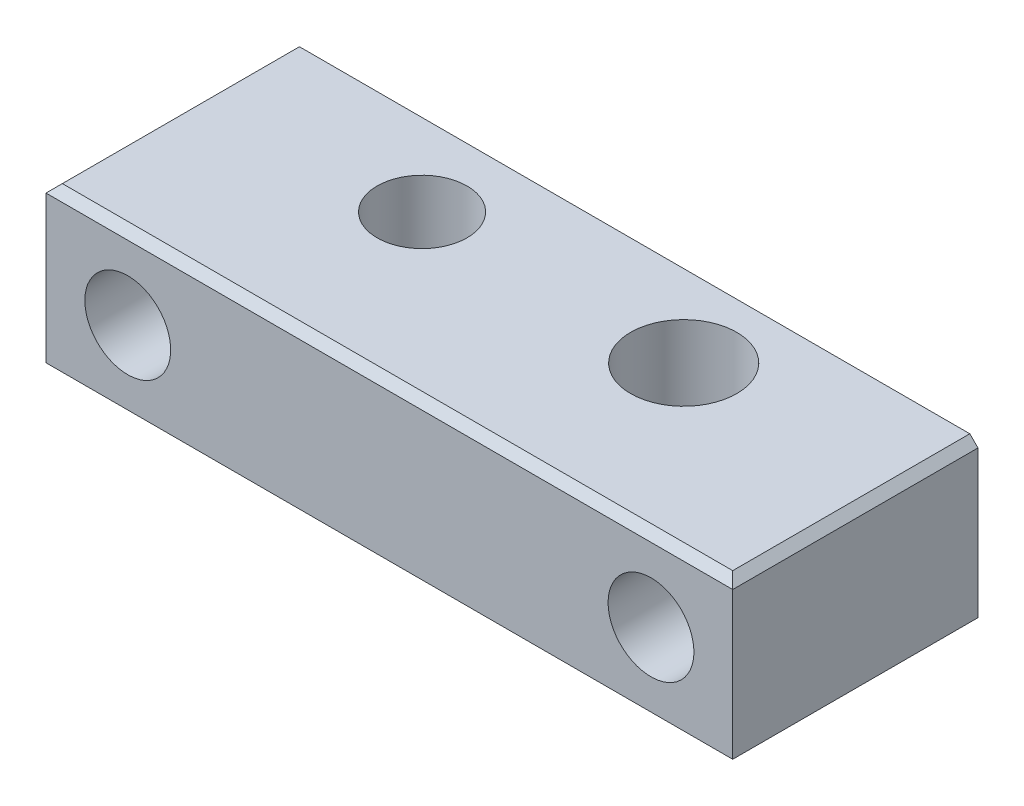
ISO-10303-21;
HEADER;
FILE_DESCRIPTION(('STEP AP214'),'2;1');
FILE_NAME('part.step','',(''),(''),'','','');
FILE_SCHEMA(('AUTOMOTIVE_DESIGN { 1 0 10303 214 1 1 1 1 }'));
ENDSEC;
DATA;
#1=APPLICATION_CONTEXT('core data for automotive mechanical design processes');
#2=APPLICATION_PROTOCOL_DEFINITION('international standard','automotive_design',2000,#1);
#3=PRODUCT_CONTEXT('',#1,'mechanical');
#4=PRODUCT('Part','Part','',(#3));
#5=PRODUCT_RELATED_PRODUCT_CATEGORY('part','',(#4));
#6=PRODUCT_DEFINITION_FORMATION('','',#4);
#7=PRODUCT_DEFINITION_CONTEXT('part definition',#1,'design');
#8=PRODUCT_DEFINITION('design','',#6,#7);
#9=PRODUCT_DEFINITION_SHAPE('','',#8);
#10=(LENGTH_UNIT() NAMED_UNIT(*) SI_UNIT(.MILLI.,.METRE.));
#11=(NAMED_UNIT(*) PLANE_ANGLE_UNIT() SI_UNIT($,.RADIAN.));
#12=(NAMED_UNIT(*) SI_UNIT($,.STERADIAN.) SOLID_ANGLE_UNIT());
#13=UNCERTAINTY_MEASURE_WITH_UNIT(LENGTH_MEASURE(1.E-05),#10,'distance_accuracy_value','');
#14=(GEOMETRIC_REPRESENTATION_CONTEXT(3) GLOBAL_UNCERTAINTY_ASSIGNED_CONTEXT((#13)) GLOBAL_UNIT_ASSIGNED_CONTEXT((#10,
#11,#12)) REPRESENTATION_CONTEXT('',''));
#15=CARTESIAN_POINT('',(0.,0.,0.));
#16=DIRECTION('',(0.,0.,1.));
#17=DIRECTION('',(1.,0.,0.));
#18=AXIS2_PLACEMENT_3D('',#15,#16,#17);
#19=CARTESIAN_POINT('',(66.675,15.8623,23.8125));
#20=DIRECTION('',(-1.,0.,0.));
#21=DIRECTION('',(0.,0.,1.));
#22=AXIS2_PLACEMENT_3D('',#19,#20,#21);
#23=PLANE('',#22);
#24=DIRECTION('',(0.,-1.,0.));
#25=VECTOR('',#24,1.);
#26=CARTESIAN_POINT('',(66.675,15.8623,-23.8125));
#27=LINE('',#26,#25);
#28=CARTESIAN_POINT('',(66.675,14.2748,-23.8125));
#29=VERTEX_POINT('',#28);
#30=CARTESIAN_POINT('',(66.675,-14.2748,-23.8125));
#31=VERTEX_POINT('',#30);
#32=EDGE_CURVE('E153',#29,#31,#27,.T.);
#33=ORIENTED_EDGE('',*,*,#32,.F.);
#34=DIRECTION('',(0.,0.,1.));
#35=VECTOR('',#34,1.);
#36=CARTESIAN_POINT('',(66.675,14.2748,23.8125));
#37=LINE('',#36,#35);
#38=CARTESIAN_POINT('',(66.675,14.2748,23.8125));
#39=VERTEX_POINT('',#38);
#40=EDGE_CURVE('E114',#29,#39,#37,.T.);
#41=ORIENTED_EDGE('',*,*,#40,.T.);
#42=DIRECTION('',(0.,-1.,0.));
#43=VECTOR('',#42,1.);
#44=CARTESIAN_POINT('',(66.675,15.8623,23.8125));
#45=LINE('',#44,#43);
#46=CARTESIAN_POINT('',(66.675,-14.2748,23.8125));
#47=VERTEX_POINT('',#46);
#48=EDGE_CURVE('E135',#39,#47,#45,.T.);
#49=ORIENTED_EDGE('',*,*,#48,.T.);
#50=DIRECTION('',(0.,0.,-1.));
#51=VECTOR('',#50,1.);
#52=CARTESIAN_POINT('',(66.675,-14.2748,-23.8125));
#53=LINE('',#52,#51);
#54=EDGE_CURVE('E119',#47,#31,#53,.T.);
#55=ORIENTED_EDGE('',*,*,#54,.T.);
#56=EDGE_LOOP('',(#33,#41,#49,#55));
#57=FACE_BOUND('',#56,.T.);
#58=ADVANCED_FACE('F45',(#57),#23,.F.);
#59=CARTESIAN_POINT('',(-66.675,15.8623,-23.8125));
#60=DIRECTION('',(0.,0.,1.));
#61=DIRECTION('',(1.,0.,0.));
#62=AXIS2_PLACEMENT_3D('',#59,#60,#61);
#63=PLANE('',#62);
#64=CARTESIAN_POINT('',(-50.8,-0.0126999999999986,-23.8125));
#65=DIRECTION('',(0.,0.,1.));
#66=DIRECTION('',(1.,0.,0.));
#67=AXIS2_PLACEMENT_3D('',#64,#65,#66);
#68=CIRCLE('',#67,12.7);
#69=CARTESIAN_POINT('',(-38.1,-0.0126999999999986,-23.8125));
#70=VERTEX_POINT('',#69);
#71=EDGE_CURVE('E440',#70,#70,#68,.T.);
#72=ORIENTED_EDGE('',*,*,#71,.T.);
#73=EDGE_LOOP('',(#72));
#74=FACE_BOUND('',#73,.T.);
#75=CARTESIAN_POINT('',(50.8,-0.0127000000000014,-23.8125));
#76=DIRECTION('',(0.,0.,1.));
#77=DIRECTION('',(1.,0.,0.));
#78=AXIS2_PLACEMENT_3D('',#75,#76,#77);
#79=CIRCLE('',#78,12.7);
#80=CARTESIAN_POINT('',(63.5,-0.0127000000000014,-23.8125));
#81=VERTEX_POINT('',#80);
#82=EDGE_CURVE('E442',#81,#81,#79,.T.);
#83=ORIENTED_EDGE('',*,*,#82,.T.);
#84=EDGE_LOOP('',(#83));
#85=FACE_BOUND('',#84,.T.);
#86=DIRECTION('',(-1.,0.,0.));
#87=VECTOR('',#86,1.);
#88=CARTESIAN_POINT('',(-66.675,15.8623,-23.8125));
#89=LINE('',#88,#87);
#90=CARTESIAN_POINT('',(65.0875,15.8623,-23.8125));
#91=VERTEX_POINT('',#90);
#92=CARTESIAN_POINT('',(-65.0875,15.8623,-23.8125));
#93=VERTEX_POINT('',#92);
#94=EDGE_CURVE('E125',#91,#93,#89,.T.);
#95=ORIENTED_EDGE('',*,*,#94,.F.);
#96=DIRECTION('',(-0.707106781186548,0.707106781186548,0.));
#97=VECTOR('',#96,1.);
#98=CARTESIAN_POINT('',(65.0875,15.8623,-23.8125));
#99=LINE('',#98,#97);
#100=EDGE_CURVE('E109',#91,#29,#99,.F.);
#101=ORIENTED_EDGE('',*,*,#100,.T.);
#102=ORIENTED_EDGE('',*,*,#32,.T.);
#103=DIRECTION('',(-0.707106781186551,-0.707106781186544,0.));
#104=VECTOR('',#103,1.);
#105=CARTESIAN_POINT('',(66.675,-14.2748,-23.8125));
#106=LINE('',#105,#104);
#107=CARTESIAN_POINT('',(65.0875,-15.8623,-23.8125));
#108=VERTEX_POINT('',#107);
#109=EDGE_CURVE('E171',#31,#108,#106,.T.);
#110=ORIENTED_EDGE('',*,*,#109,.T.);
#111=DIRECTION('',(-1.,0.,0.));
#112=VECTOR('',#111,1.);
#113=CARTESIAN_POINT('',(-66.675,-15.8623,-23.8125));
#114=LINE('',#113,#112);
#115=CARTESIAN_POINT('',(-65.0875,-15.8623,-23.8125));
#116=VERTEX_POINT('',#115);
#117=EDGE_CURVE('E136',#108,#116,#114,.T.);
#118=ORIENTED_EDGE('',*,*,#117,.T.);
#119=DIRECTION('',(-0.707106781186551,0.707106781186544,0.));
#120=VECTOR('',#119,1.);
#121=CARTESIAN_POINT('',(-66.675,-14.2748,-23.8125));
#122=LINE('',#121,#120);
#123=CARTESIAN_POINT('',(-66.675,-14.2748,-23.8125));
#124=VERTEX_POINT('',#123);
#125=EDGE_CURVE('E130',#116,#124,#122,.T.);
#126=ORIENTED_EDGE('',*,*,#125,.T.);
#127=DIRECTION('',(0.,-1.,0.));
#128=VECTOR('',#127,1.);
#129=CARTESIAN_POINT('',(-66.675,15.8623,-23.8125));
#130=LINE('',#129,#128);
#131=CARTESIAN_POINT('',(-66.675,14.2748,-23.8125));
#132=VERTEX_POINT('',#131);
#133=EDGE_CURVE('E150',#132,#124,#130,.T.);
#134=ORIENTED_EDGE('',*,*,#133,.F.);
#135=DIRECTION('',(-0.707106781186548,-0.707106781186548,0.));
#136=VECTOR('',#135,1.);
#137=CARTESIAN_POINT('',(-65.0875,15.8623,-23.8125));
#138=LINE('',#137,#136);
#139=EDGE_CURVE('E120',#132,#93,#138,.F.);
#140=ORIENTED_EDGE('',*,*,#139,.T.);
#141=EDGE_LOOP('',(#95,#101,#102,#110,#118,#126,#134,#140));
#142=FACE_BOUND('',#141,.T.);
#143=ADVANCED_FACE('F132',(#74,#85,#142),#63,.F.);
#144=CARTESIAN_POINT('',(-66.675,15.8623,23.8125));
#145=DIRECTION('',(1.,0.,0.));
#146=DIRECTION('',(0.,0.,-1.));
#147=AXIS2_PLACEMENT_3D('',#144,#145,#146);
#148=PLANE('',#147);
#149=DIRECTION('',(0.,-1.,0.));
#150=VECTOR('',#149,1.);
#151=CARTESIAN_POINT('',(-66.675,15.8623,23.8125));
#152=LINE('',#151,#150);
#153=CARTESIAN_POINT('',(-66.675,14.2748,23.8125));
#154=VERTEX_POINT('',#153);
#155=CARTESIAN_POINT('',(-66.675,-14.2748,23.8125));
#156=VERTEX_POINT('',#155);
#157=EDGE_CURVE('E139',#154,#156,#152,.T.);
#158=ORIENTED_EDGE('',*,*,#157,.F.);
#159=DIRECTION('',(0.,0.,-1.));
#160=VECTOR('',#159,1.);
#161=CARTESIAN_POINT('',(-66.675,14.2748,23.8125));
#162=LINE('',#161,#160);
#163=EDGE_CURVE('E183',#154,#132,#162,.T.);
#164=ORIENTED_EDGE('',*,*,#163,.T.);
#165=ORIENTED_EDGE('',*,*,#133,.T.);
#166=DIRECTION('',(0.,0.,1.));
#167=VECTOR('',#166,1.);
#168=CARTESIAN_POINT('',(-66.675,-14.2748,23.8125));
#169=LINE('',#168,#167);
#170=EDGE_CURVE('E181',#124,#156,#169,.T.);
#171=ORIENTED_EDGE('',*,*,#170,.T.);
#172=EDGE_LOOP('',(#158,#164,#165,#171));
#173=FACE_BOUND('',#172,.T.);
#174=ADVANCED_FACE('F221',(#173),#148,.F.);
#175=CARTESIAN_POINT('',(-66.675,15.8623,23.8125));
#176=DIRECTION('',(0.,0.,-1.));
#177=DIRECTION('',(-1.,0.,0.));
#178=AXIS2_PLACEMENT_3D('',#175,#176,#177);
#179=PLANE('',#178);
#180=CARTESIAN_POINT('',(-50.8,-0.0126999999999986,23.8125));
#181=DIRECTION('',(0.,0.,-1.));
#182=DIRECTION('',(-1.,0.,0.));
#183=AXIS2_PLACEMENT_3D('',#180,#181,#182);
#184=CIRCLE('',#183,8.3312);
#185=CARTESIAN_POINT('',(-59.1312,-0.0126999999999986,23.8125));
#186=VERTEX_POINT('',#185);
#187=EDGE_CURVE('E142',#186,#186,#184,.F.);
#188=ORIENTED_EDGE('',*,*,#187,.F.);
#189=EDGE_LOOP('',(#188));
#190=FACE_BOUND('',#189,.T.);
#191=CARTESIAN_POINT('',(50.8,-0.0127000000000014,23.8125));
#192=DIRECTION('',(0.,0.,-1.));
#193=DIRECTION('',(-1.,0.,0.));
#194=AXIS2_PLACEMENT_3D('',#191,#192,#193);
#195=CIRCLE('',#194,8.3312);
#196=CARTESIAN_POINT('',(42.4688,-0.0127000000000014,23.8125));
#197=VERTEX_POINT('',#196);
#198=EDGE_CURVE('E156',#197,#197,#195,.F.);
#199=ORIENTED_EDGE('',*,*,#198,.F.);
#200=EDGE_LOOP('',(#199));
#201=FACE_BOUND('',#200,.T.);
#202=ORIENTED_EDGE('',*,*,#48,.F.);
#203=DIRECTION('',(-1.,0.,0.));
#204=VECTOR('',#203,1.);
#205=CARTESIAN_POINT('',(-66.675,14.2748,23.8125));
#206=LINE('',#205,#204);
#207=EDGE_CURVE('E179',#39,#154,#206,.T.);
#208=ORIENTED_EDGE('',*,*,#207,.T.);
#209=ORIENTED_EDGE('',*,*,#157,.T.);
#210=DIRECTION('',(1.,0.,0.));
#211=VECTOR('',#210,1.);
#212=CARTESIAN_POINT('',(66.675,-14.2748,23.8125));
#213=LINE('',#212,#211);
#214=EDGE_CURVE('E177',#156,#47,#213,.T.);
#215=ORIENTED_EDGE('',*,*,#214,.T.);
#216=EDGE_LOOP('',(#202,#208,#209,#215));
#217=FACE_BOUND('',#216,.T.);
#218=ADVANCED_FACE('F212',(#190,#201,#217),#179,.F.);
#219=CARTESIAN_POINT('',(0.,15.8623,0.));
#220=DIRECTION('',(0.,-1.,0.));
#221=DIRECTION('',(0.,0.,-1.));
#222=AXIS2_PLACEMENT_3D('',#219,#220,#221);
#223=PLANE('',#222);
#224=CARTESIAN_POINT('',(-25.4,15.8623,-7.9375));
#225=DIRECTION('',(0.,-1.,0.));
#226=DIRECTION('',(0.,0.,-1.));
#227=AXIS2_PLACEMENT_3D('',#224,#225,#226);
#228=CIRCLE('',#227,8.73124999999998);
#229=CARTESIAN_POINT('',(-25.4,15.8623,-16.66875));
#230=VERTEX_POINT('',#229);
#231=EDGE_CURVE('E426',#230,#230,#228,.T.);
#232=ORIENTED_EDGE('',*,*,#231,.T.);
#233=EDGE_LOOP('',(#232));
#234=FACE_BOUND('',#233,.T.);
#235=CARTESIAN_POINT('',(25.4,15.8623,-7.9375));
#236=DIRECTION('',(0.,1.,0.));
#237=DIRECTION('',(0.,0.,1.));
#238=AXIS2_PLACEMENT_3D('',#235,#236,#237);
#239=CIRCLE('',#238,10.3124);
#240=CARTESIAN_POINT('',(25.4,15.8623,2.3749));
#241=VERTEX_POINT('',#240);
#242=EDGE_CURVE('E433',#241,#241,#239,.T.);
#243=ORIENTED_EDGE('',*,*,#242,.F.);
#244=EDGE_LOOP('',(#243));
#245=FACE_BOUND('',#244,.T.);
#246=DIRECTION('',(1.,0.,0.));
#247=VECTOR('',#246,1.);
#248=CARTESIAN_POINT('',(0.,15.8623,22.225));
#249=LINE('',#248,#247);
#250=CARTESIAN_POINT('',(-65.0875,15.8623,22.225));
#251=VERTEX_POINT('',#250);
#252=CARTESIAN_POINT('',(65.0875,15.8623,22.225));
#253=VERTEX_POINT('',#252);
#254=EDGE_CURVE('E128',#251,#253,#249,.T.);
#255=ORIENTED_EDGE('',*,*,#254,.T.);
#256=DIRECTION('',(0.,0.,-1.));
#257=VECTOR('',#256,1.);
#258=CARTESIAN_POINT('',(65.0875,15.8623,0.));
#259=LINE('',#258,#257);
#260=EDGE_CURVE('E113',#253,#91,#259,.T.);
#261=ORIENTED_EDGE('',*,*,#260,.T.);
#262=ORIENTED_EDGE('',*,*,#94,.T.);
#263=DIRECTION('',(0.,0.,1.));
#264=VECTOR('',#263,1.);
#265=CARTESIAN_POINT('',(-65.0875,15.8623,0.));
#266=LINE('',#265,#264);
#267=EDGE_CURVE('E155',#93,#251,#266,.T.);
#268=ORIENTED_EDGE('',*,*,#267,.T.);
#269=EDGE_LOOP('',(#255,#261,#262,#268));
#270=FACE_BOUND('',#269,.T.);
#271=ADVANCED_FACE('F124',(#234,#245,#270),#223,.F.);
#272=CARTESIAN_POINT('',(0.,-15.8623,0.));
#273=DIRECTION('',(0.,-1.,0.));
#274=DIRECTION('',(0.,0.,-1.));
#275=AXIS2_PLACEMENT_3D('',#272,#273,#274);
#276=PLANE('',#275);
#277=CARTESIAN_POINT('',(-25.4,-15.8623,-7.9375));
#278=DIRECTION('',(0.,-1.,0.));
#279=DIRECTION('',(0.,0.,-1.));
#280=AXIS2_PLACEMENT_3D('',#277,#278,#279);
#281=CIRCLE('',#280,8.73124999999999);
#282=CARTESIAN_POINT('',(-25.4,-15.8623,-16.66875));
#283=VERTEX_POINT('',#282);
#284=EDGE_CURVE('E192',#283,#283,#281,.T.);
#285=ORIENTED_EDGE('',*,*,#284,.F.);
#286=EDGE_LOOP('',(#285));
#287=FACE_BOUND('',#286,.T.);
#288=CARTESIAN_POINT('',(25.4,-15.8623,-7.9375));
#289=DIRECTION('',(0.,1.,0.));
#290=DIRECTION('',(0.,0.,1.));
#291=AXIS2_PLACEMENT_3D('',#288,#289,#290);
#292=CIRCLE('',#291,10.3124);
#293=CARTESIAN_POINT('',(25.4,-15.8623,2.3749));
#294=VERTEX_POINT('',#293);
#295=EDGE_CURVE('E430',#294,#294,#292,.T.);
#296=ORIENTED_EDGE('',*,*,#295,.T.);
#297=EDGE_LOOP('',(#296));
#298=FACE_BOUND('',#297,.T.);
#299=ORIENTED_EDGE('',*,*,#117,.F.);
#300=DIRECTION('',(0.,0.,1.));
#301=VECTOR('',#300,1.);
#302=CARTESIAN_POINT('',(65.0875,-15.8623,23.8125));
#303=LINE('',#302,#301);
#304=CARTESIAN_POINT('',(65.0875,-15.8623,22.225));
#305=VERTEX_POINT('',#304);
#306=EDGE_CURVE('E11',#108,#305,#303,.T.);
#307=ORIENTED_EDGE('',*,*,#306,.T.);
#308=DIRECTION('',(-1.,0.,0.));
#309=VECTOR('',#308,1.);
#310=CARTESIAN_POINT('',(-66.675,-15.8623,22.225));
#311=LINE('',#310,#309);
#312=CARTESIAN_POINT('',(-65.0875,-15.8623,22.225));
#313=VERTEX_POINT('',#312);
#314=EDGE_CURVE('E55',#305,#313,#311,.T.);
#315=ORIENTED_EDGE('',*,*,#314,.T.);
#316=DIRECTION('',(0.,0.,-1.));
#317=VECTOR('',#316,1.);
#318=CARTESIAN_POINT('',(-65.0875,-15.8623,-23.8125));
#319=LINE('',#318,#317);
#320=EDGE_CURVE('E185',#313,#116,#319,.T.);
#321=ORIENTED_EDGE('',*,*,#320,.T.);
#322=EDGE_LOOP('',(#299,#307,#315,#321));
#323=FACE_BOUND('',#322,.T.);
#324=ADVANCED_FACE('F206',(#287,#298,#323),#276,.T.);
#325=CARTESIAN_POINT('',(50.8,-0.0127000000000014,109.5375));
#326=DIRECTION('',(0.,0.,-1.));
#327=DIRECTION('',(-1.,0.,0.));
#328=AXIS2_PLACEMENT_3D('',#325,#326,#327);
#329=CYLINDRICAL_SURFACE('',#328,8.3312);
#330=CARTESIAN_POINT('',(50.8,-0.0127000000000014,-7.9375));
#331=DIRECTION('',(0.,0.,1.));
#332=DIRECTION('',(1.,0.,0.));
#333=AXIS2_PLACEMENT_3D('',#330,#331,#332);
#334=CIRCLE('',#333,8.3312);
#335=CARTESIAN_POINT('',(59.1312,-0.0127000000000014,-7.9375));
#336=VERTEX_POINT('',#335);
#337=EDGE_CURVE('E159',#336,#336,#334,.T.);
#338=ORIENTED_EDGE('',*,*,#337,.F.);
#339=EDGE_LOOP('',(#338));
#340=FACE_BOUND('',#339,.T.);
#341=ORIENTED_EDGE('',*,*,#198,.T.);
#342=EDGE_LOOP('',(#341));
#343=FACE_BOUND('',#342,.T.);
#344=ADVANCED_FACE('F290',(#340,#343),#329,.F.);
#345=CARTESIAN_POINT('',(-50.8,-0.0126999999999986,109.5375));
#346=DIRECTION('',(0.,0.,-1.));
#347=DIRECTION('',(-1.,0.,0.));
#348=AXIS2_PLACEMENT_3D('',#345,#346,#347);
#349=CYLINDRICAL_SURFACE('',#348,8.3312);
#350=CARTESIAN_POINT('',(-50.8,-0.0126999999999986,-7.9375));
#351=DIRECTION('',(0.,0.,1.));
#352=DIRECTION('',(1.,0.,0.));
#353=AXIS2_PLACEMENT_3D('',#350,#351,#352);
#354=CIRCLE('',#353,8.3312);
#355=CARTESIAN_POINT('',(-42.4688,-0.0126999999999986,-7.9375));
#356=VERTEX_POINT('',#355);
#357=EDGE_CURVE('E162',#356,#356,#354,.T.);
#358=ORIENTED_EDGE('',*,*,#357,.F.);
#359=EDGE_LOOP('',(#358));
#360=FACE_BOUND('',#359,.T.);
#361=ORIENTED_EDGE('',*,*,#187,.T.);
#362=EDGE_LOOP('',(#361));
#363=FACE_BOUND('',#362,.T.);
#364=ADVANCED_FACE('F334',(#360,#363),#349,.F.);
#365=CARTESIAN_POINT('',(-50.8,-0.0126999999999986,-7.9375));
#366=DIRECTION('',(0.,0.,-1.));
#367=DIRECTION('',(-1.,0.,0.));
#368=AXIS2_PLACEMENT_3D('',#365,#366,#367);
#369=CYLINDRICAL_SURFACE('',#368,12.7);
#370=CARTESIAN_POINT('',(-50.8,-0.0126999999999986,-7.9375));
#371=DIRECTION('',(0.,0.,1.));
#372=DIRECTION('',(1.,0.,0.));
#373=AXIS2_PLACEMENT_3D('',#370,#371,#372);
#374=CIRCLE('',#373,12.7);
#375=CARTESIAN_POINT('',(-38.1,-0.0126999999999986,-7.9375));
#376=VERTEX_POINT('',#375);
#377=EDGE_CURVE('E165',#376,#376,#374,.T.);
#378=ORIENTED_EDGE('',*,*,#377,.T.);
#379=EDGE_LOOP('',(#378));
#380=FACE_BOUND('',#379,.T.);
#381=ORIENTED_EDGE('',*,*,#71,.F.);
#382=EDGE_LOOP('',(#381));
#383=FACE_BOUND('',#382,.T.);
#384=ADVANCED_FACE('F343',(#380,#383),#369,.F.);
#385=CARTESIAN_POINT('',(-50.8,-0.0126999999999986,-7.9375));
#386=DIRECTION('',(0.,0.,1.));
#387=DIRECTION('',(1.,0.,0.));
#388=AXIS2_PLACEMENT_3D('',#385,#386,#387);
#389=PLANE('',#388);
#390=ORIENTED_EDGE('',*,*,#357,.T.);
#391=EDGE_LOOP('',(#390));
#392=FACE_BOUND('',#391,.T.);
#393=ORIENTED_EDGE('',*,*,#377,.F.);
#394=EDGE_LOOP('',(#393));
#395=FACE_BOUND('',#394,.T.);
#396=ADVANCED_FACE('F352',(#392,#395),#389,.F.);
#397=CARTESIAN_POINT('',(50.8,-0.0127000000000014,-7.9375));
#398=DIRECTION('',(0.,0.,-1.));
#399=DIRECTION('',(-1.,0.,0.));
#400=AXIS2_PLACEMENT_3D('',#397,#398,#399);
#401=CYLINDRICAL_SURFACE('',#400,12.7);
#402=CARTESIAN_POINT('',(50.8,-0.0127000000000014,-7.9375));
#403=DIRECTION('',(0.,0.,1.));
#404=DIRECTION('',(1.,0.,0.));
#405=AXIS2_PLACEMENT_3D('',#402,#403,#404);
#406=CIRCLE('',#405,12.7);
#407=CARTESIAN_POINT('',(63.5,-0.0127000000000014,-7.9375));
#408=VERTEX_POINT('',#407);
#409=EDGE_CURVE('E145',#408,#408,#406,.T.);
#410=ORIENTED_EDGE('',*,*,#409,.T.);
#411=EDGE_LOOP('',(#410));
#412=FACE_BOUND('',#411,.T.);
#413=ORIENTED_EDGE('',*,*,#82,.F.);
#414=EDGE_LOOP('',(#413));
#415=FACE_BOUND('',#414,.T.);
#416=ADVANCED_FACE('F361',(#412,#415),#401,.F.);
#417=CARTESIAN_POINT('',(50.8,-0.0127000000000014,-7.9375));
#418=DIRECTION('',(0.,0.,1.));
#419=DIRECTION('',(1.,0.,0.));
#420=AXIS2_PLACEMENT_3D('',#417,#418,#419);
#421=PLANE('',#420);
#422=ORIENTED_EDGE('',*,*,#337,.T.);
#423=EDGE_LOOP('',(#422));
#424=FACE_BOUND('',#423,.T.);
#425=ORIENTED_EDGE('',*,*,#409,.F.);
#426=EDGE_LOOP('',(#425));
#427=FACE_BOUND('',#426,.T.);
#428=ADVANCED_FACE('F370',(#424,#427),#421,.F.);
#429=CARTESIAN_POINT('',(25.4,15.8623,-7.9375));
#430=DIRECTION('',(0.,-1.,0.));
#431=DIRECTION('',(0.,0.,-1.));
#432=AXIS2_PLACEMENT_3D('',#429,#430,#431);
#433=CYLINDRICAL_SURFACE('',#432,10.3124);
#434=ORIENTED_EDGE('',*,*,#242,.T.);
#435=EDGE_LOOP('',(#434));
#436=FACE_BOUND('',#435,.T.);
#437=ORIENTED_EDGE('',*,*,#295,.F.);
#438=EDGE_LOOP('',(#437));
#439=FACE_BOUND('',#438,.T.);
#440=ADVANCED_FACE('F379',(#436,#439),#433,.F.);
#441=CARTESIAN_POINT('',(-25.4,-15.8623,-7.9375));
#442=DIRECTION('',(0.,-1.,0.));
#443=DIRECTION('',(0.,0.,-1.));
#444=AXIS2_PLACEMENT_3D('',#441,#442,#443);
#445=CYLINDRICAL_SURFACE('',#444,8.73124999999998);
#446=ORIENTED_EDGE('',*,*,#231,.F.);
#447=EDGE_LOOP('',(#446));
#448=FACE_BOUND('',#447,.T.);
#449=ORIENTED_EDGE('',*,*,#284,.T.);
#450=EDGE_LOOP('',(#449));
#451=FACE_BOUND('',#450,.T.);
#452=ADVANCED_FACE('F253',(#448,#451),#445,.F.);
#453=CARTESIAN_POINT('',(-65.0875,15.8623,0.));
#454=DIRECTION('',(0.707106781186547,-0.707106781186547,0.));
#455=DIRECTION('',(0.,0.,1.));
#456=AXIS2_PLACEMENT_3D('',#453,#454,#455);
#457=PLANE('',#456);
#458=ORIENTED_EDGE('',*,*,#139,.F.);
#459=ORIENTED_EDGE('',*,*,#163,.F.);
#460=DIRECTION('',(0.577350269189626,0.577350269189626,-0.577350269189626));
#461=VECTOR('',#460,1.);
#462=CARTESIAN_POINT('',(-57.6791666666667,23.2706333333333,14.8166666666667));
#463=LINE('',#462,#461);
#464=EDGE_CURVE('E190',#251,#154,#463,.F.);
#465=ORIENTED_EDGE('',*,*,#464,.F.);
#466=ORIENTED_EDGE('',*,*,#267,.F.);
#467=EDGE_LOOP('',(#458,#459,#465,#466));
#468=FACE_BOUND('',#467,.T.);
#469=ADVANCED_FACE('F219',(#468),#457,.F.);
#470=CARTESIAN_POINT('',(0.,15.8623,22.225));
#471=DIRECTION('',(0.,-0.707106781186547,-0.707106781186547));
#472=DIRECTION('',(1.,0.,0.));
#473=AXIS2_PLACEMENT_3D('',#470,#471,#472);
#474=PLANE('',#473);
#475=ORIENTED_EDGE('',*,*,#464,.T.);
#476=ORIENTED_EDGE('',*,*,#207,.F.);
#477=DIRECTION('',(-0.577350269189626,0.577350269189626,-0.577350269189626));
#478=VECTOR('',#477,1.);
#479=CARTESIAN_POINT('',(43.3916666666667,37.5581333333333,0.529166666666681));
#480=LINE('',#479,#478);
#481=EDGE_CURVE('E188',#253,#39,#480,.F.);
#482=ORIENTED_EDGE('',*,*,#481,.F.);
#483=ORIENTED_EDGE('',*,*,#254,.F.);
#484=EDGE_LOOP('',(#475,#476,#482,#483));
#485=FACE_BOUND('',#484,.T.);
#486=ADVANCED_FACE('F215',(#485),#474,.F.);
#487=CARTESIAN_POINT('',(65.0875,15.8623,0.));
#488=DIRECTION('',(-0.707106781186547,-0.707106781186547,0.));
#489=DIRECTION('',(0.,0.,-1.));
#490=AXIS2_PLACEMENT_3D('',#487,#488,#489);
#491=PLANE('',#490);
#492=ORIENTED_EDGE('',*,*,#481,.T.);
#493=ORIENTED_EDGE('',*,*,#40,.F.);
#494=ORIENTED_EDGE('',*,*,#100,.F.);
#495=ORIENTED_EDGE('',*,*,#260,.F.);
#496=EDGE_LOOP('',(#492,#493,#494,#495));
#497=FACE_BOUND('',#496,.T.);
#498=ADVANCED_FACE('F112',(#497),#491,.F.);
#499=CARTESIAN_POINT('',(-66.675,-14.2748,23.8125));
#500=DIRECTION('',(-0.707106781186544,-0.707106781186551,0.));
#501=DIRECTION('',(0.,0.,-1.));
#502=AXIS2_PLACEMENT_3D('',#499,#500,#501);
#503=PLANE('',#502);
#504=ORIENTED_EDGE('',*,*,#125,.F.);
#505=ORIENTED_EDGE('',*,*,#320,.F.);
#506=DIRECTION('',(-0.577350269189628,0.577350269189622,0.577350269189628));
#507=VECTOR('',#506,1.);
#508=CARTESIAN_POINT('',(-66.675,-14.2748,23.8125));
#509=LINE('',#508,#507);
#510=EDGE_CURVE('E50',#156,#313,#509,.F.);
#511=ORIENTED_EDGE('',*,*,#510,.F.);
#512=ORIENTED_EDGE('',*,*,#170,.F.);
#513=EDGE_LOOP('',(#504,#505,#511,#512));
#514=FACE_BOUND('',#513,.T.);
#515=ADVANCED_FACE('F48',(#514),#503,.T.);
#516=CARTESIAN_POINT('',(-66.675,-14.2748,23.8125));
#517=DIRECTION('',(0.,-0.707106781186551,0.707106781186544));
#518=DIRECTION('',(-1.,0.,0.));
#519=AXIS2_PLACEMENT_3D('',#516,#517,#518);
#520=PLANE('',#519);
#521=ORIENTED_EDGE('',*,*,#510,.T.);
#522=ORIENTED_EDGE('',*,*,#314,.F.);
#523=DIRECTION('',(0.577350269189628,0.577350269189622,0.577350269189628));
#524=VECTOR('',#523,1.);
#525=CARTESIAN_POINT('',(22.2249999999998,-58.7247999999999,-20.6375000000003));
#526=LINE('',#525,#524);
#527=EDGE_CURVE('E193',#47,#305,#526,.F.);
#528=ORIENTED_EDGE('',*,*,#527,.F.);
#529=ORIENTED_EDGE('',*,*,#214,.F.);
#530=EDGE_LOOP('',(#521,#522,#528,#529));
#531=FACE_BOUND('',#530,.T.);
#532=ADVANCED_FACE('F202',(#531),#520,.T.);
#533=CARTESIAN_POINT('',(66.675,-14.2748,23.8125));
#534=DIRECTION('',(0.707106781186544,-0.707106781186551,0.));
#535=DIRECTION('',(0.,0.,1.));
#536=AXIS2_PLACEMENT_3D('',#533,#534,#535);
#537=PLANE('',#536);
#538=ORIENTED_EDGE('',*,*,#527,.T.);
#539=ORIENTED_EDGE('',*,*,#306,.F.);
#540=ORIENTED_EDGE('',*,*,#109,.F.);
#541=ORIENTED_EDGE('',*,*,#54,.F.);
#542=EDGE_LOOP('',(#538,#539,#540,#541));
#543=FACE_BOUND('',#542,.T.);
#544=ADVANCED_FACE('F207',(#543),#537,.T.);
#545=CLOSED_SHELL('',(#58,#143,#174,#218,#271,#324,#344,#364,#384,#396,#416,#428,#440,#452,#469,
#486,#498,#515,#532,#544));
#546=MANIFOLD_SOLID_BREP('B2',#545);
#547=ADVANCED_BREP_SHAPE_REPRESENTATION('',(#18,#546),#14);
#548=SHAPE_DEFINITION_REPRESENTATION(#9,#547);
ENDSEC;
END-ISO-10303-21;
